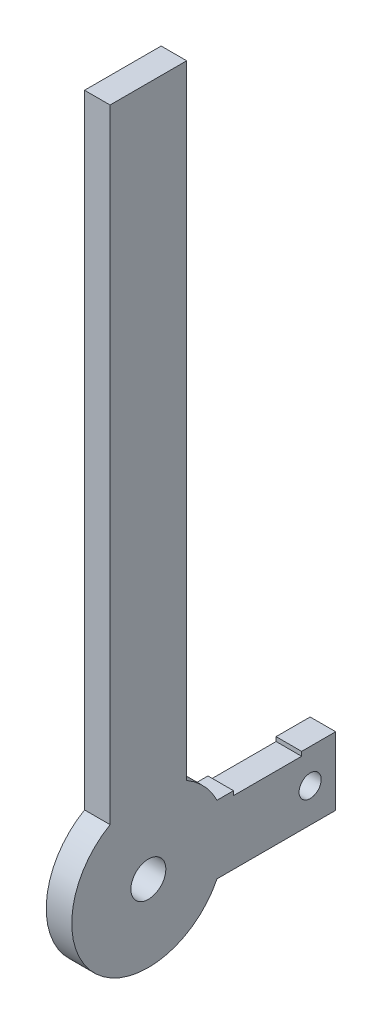
ISO-10303-21;
HEADER;
FILE_DESCRIPTION(('STEP AP214'),'2;1');
FILE_NAME('part.step','',(''),(''),'','','');
FILE_SCHEMA(('AUTOMOTIVE_DESIGN { 1 0 10303 214 1 1 1 1 }'));
ENDSEC;
DATA;
#1=APPLICATION_CONTEXT('core data for automotive mechanical design processes');
#2=APPLICATION_PROTOCOL_DEFINITION('international standard','automotive_design',2000,#1);
#3=PRODUCT_CONTEXT('',#1,'mechanical');
#4=PRODUCT('Part','Part','',(#3));
#5=PRODUCT_RELATED_PRODUCT_CATEGORY('part','',(#4));
#6=PRODUCT_DEFINITION_FORMATION('','',#4);
#7=PRODUCT_DEFINITION_CONTEXT('part definition',#1,'design');
#8=PRODUCT_DEFINITION('design','',#6,#7);
#9=PRODUCT_DEFINITION_SHAPE('','',#8);
#10=(LENGTH_UNIT() NAMED_UNIT(*) SI_UNIT(.MILLI.,.METRE.));
#11=(NAMED_UNIT(*) PLANE_ANGLE_UNIT() SI_UNIT($,.RADIAN.));
#12=(NAMED_UNIT(*) SI_UNIT($,.STERADIAN.) SOLID_ANGLE_UNIT());
#13=UNCERTAINTY_MEASURE_WITH_UNIT(LENGTH_MEASURE(1.E-05),#10,'distance_accuracy_value','');
#14=(GEOMETRIC_REPRESENTATION_CONTEXT(3) GLOBAL_UNCERTAINTY_ASSIGNED_CONTEXT((#13)) GLOBAL_UNIT_ASSIGNED_CONTEXT((#10,
#11,#12)) REPRESENTATION_CONTEXT('',''));
#15=CARTESIAN_POINT('',(0.,0.,0.));
#16=DIRECTION('',(0.,0.,1.));
#17=DIRECTION('',(1.,0.,0.));
#18=AXIS2_PLACEMENT_3D('',#15,#16,#17);
#19=CARTESIAN_POINT('',(0.,-67.,-38.));
#20=DIRECTION('',(0.,1.,0.));
#21=DIRECTION('',(0.,0.,1.));
#22=AXIS2_PLACEMENT_3D('',#19,#20,#21);
#23=PLANE('',#22);
#24=DIRECTION('',(1.,0.,0.));
#25=VECTOR('',#24,1.);
#26=CARTESIAN_POINT('',(0.,-67.,-14.));
#27=LINE('',#26,#25);
#28=CARTESIAN_POINT('',(-3.,-67.,-14.));
#29=VERTEX_POINT('',#28);
#30=CARTESIAN_POINT('',(3.,-67.,-14.));
#31=VERTEX_POINT('',#30);
#32=EDGE_CURVE('E25',#29,#31,#27,.T.);
#33=ORIENTED_EDGE('',*,*,#32,.F.);
#34=DIRECTION('',(0.,0.,1.));
#35=VECTOR('',#34,1.);
#36=CARTESIAN_POINT('',(-3.,-67.,-38.));
#37=LINE('',#36,#35);
#38=CARTESIAN_POINT('',(-3.,-67.,-10.1245154965971));
#39=VERTEX_POINT('',#38);
#40=EDGE_CURVE('E41',#29,#39,#37,.T.);
#41=ORIENTED_EDGE('',*,*,#40,.T.);
#42=DIRECTION('',(1.,0.,0.));
#43=VECTOR('',#42,1.);
#44=CARTESIAN_POINT('',(-3.,-67.,-10.1245154965971));
#45=LINE('',#44,#43);
#46=CARTESIAN_POINT('',(3.,-67.,-10.1245154965971));
#47=VERTEX_POINT('',#46);
#48=EDGE_CURVE('E191',#39,#47,#45,.T.);
#49=ORIENTED_EDGE('',*,*,#48,.T.);
#50=DIRECTION('',(0.,0.,1.));
#51=VECTOR('',#50,1.);
#52=CARTESIAN_POINT('',(3.,-67.,-38.));
#53=LINE('',#52,#51);
#54=EDGE_CURVE('E148',#31,#47,#53,.T.);
#55=ORIENTED_EDGE('',*,*,#54,.F.);
#56=EDGE_LOOP('',(#33,#41,#49,#55));
#57=FACE_BOUND('',#56,.T.);
#58=ADVANCED_FACE('F16',(#57),#23,.T.);
#59=CARTESIAN_POINT('',(-3.,-75.,6.));
#60=DIRECTION('',(1.,0.,0.));
#61=DIRECTION('',(0.,0.,-1.));
#62=AXIS2_PLACEMENT_3D('',#59,#60,#61);
#63=CYLINDRICAL_SURFACE('',#62,18.);
#64=DIRECTION('',(1.,0.,0.));
#65=VECTOR('',#64,1.);
#66=CARTESIAN_POINT('',(-3.,-83.,-10.1245154965971));
#67=LINE('',#66,#65);
#68=CARTESIAN_POINT('',(3.,-83.,-10.1245154965971));
#69=VERTEX_POINT('',#68);
#70=CARTESIAN_POINT('',(-3.,-83.,-10.1245154965971));
#71=VERTEX_POINT('',#70);
#72=EDGE_CURVE('E193',#69,#71,#67,.F.);
#73=ORIENTED_EDGE('',*,*,#72,.F.);
#74=CARTESIAN_POINT('',(3.,-75.,6.));
#75=DIRECTION('',(-1.,0.,0.));
#76=DIRECTION('',(0.,0.,1.));
#77=AXIS2_PLACEMENT_3D('',#74,#75,#76);
#78=CIRCLE('',#77,18.);
#79=CARTESIAN_POINT('',(3.,-59.4115427318801,15.));
#80=VERTEX_POINT('',#79);
#81=EDGE_CURVE('E160',#69,#80,#78,.T.);
#82=ORIENTED_EDGE('',*,*,#81,.T.);
#83=DIRECTION('',(1.,0.,0.));
#84=VECTOR('',#83,1.);
#85=CARTESIAN_POINT('',(-3.,-59.4115427318801,15.));
#86=LINE('',#85,#84);
#87=CARTESIAN_POINT('',(-3.,-59.4115427318801,15.));
#88=VERTEX_POINT('',#87);
#89=EDGE_CURVE('E167',#80,#88,#86,.F.);
#90=ORIENTED_EDGE('',*,*,#89,.T.);
#91=CARTESIAN_POINT('',(-3.,-75.,6.));
#92=DIRECTION('',(1.,0.,0.));
#93=DIRECTION('',(0.,0.,-1.));
#94=AXIS2_PLACEMENT_3D('',#91,#92,#93);
#95=CIRCLE('',#94,18.);
#96=EDGE_CURVE('E158',#88,#71,#95,.T.);
#97=ORIENTED_EDGE('',*,*,#96,.T.);
#98=EDGE_LOOP('',(#73,#82,#90,#97));
#99=FACE_BOUND('',#98,.T.);
#100=ADVANCED_FACE('F230',(#99),#63,.T.);
#101=CARTESIAN_POINT('',(0.,3.5,15.));
#102=DIRECTION('',(0.,0.,1.));
#103=DIRECTION('',(1.,0.,0.));
#104=AXIS2_PLACEMENT_3D('',#101,#102,#103);
#105=PLANE('',#104);
#106=ORIENTED_EDGE('',*,*,#89,.F.);
#107=DIRECTION('',(0.,-1.,0.));
#108=VECTOR('',#107,1.);
#109=CARTESIAN_POINT('',(3.,3.5,15.));
#110=LINE('',#109,#108);
#111=CARTESIAN_POINT('',(3.,87.,15.));
#112=VERTEX_POINT('',#111);
#113=EDGE_CURVE('E184',#112,#80,#110,.T.);
#114=ORIENTED_EDGE('',*,*,#113,.F.);
#115=DIRECTION('',(1.,0.,0.));
#116=VECTOR('',#115,1.);
#117=CARTESIAN_POINT('',(0.,87.,15.));
#118=LINE('',#117,#116);
#119=CARTESIAN_POINT('',(-3.,87.,15.));
#120=VERTEX_POINT('',#119);
#121=EDGE_CURVE('E187',#120,#112,#118,.T.);
#122=ORIENTED_EDGE('',*,*,#121,.F.);
#123=DIRECTION('',(0.,1.,0.));
#124=VECTOR('',#123,1.);
#125=CARTESIAN_POINT('',(-3.,3.5,15.));
#126=LINE('',#125,#124);
#127=EDGE_CURVE('E189',#88,#120,#126,.T.);
#128=ORIENTED_EDGE('',*,*,#127,.F.);
#129=EDGE_LOOP('',(#106,#114,#122,#128));
#130=FACE_BOUND('',#129,.T.);
#131=ADVANCED_FACE('F18',(#130),#105,.T.);
#132=CARTESIAN_POINT('',(-3.,3.5,-3.));
#133=DIRECTION('',(-1.,0.,0.));
#134=DIRECTION('',(0.,0.,1.));
#135=AXIS2_PLACEMENT_3D('',#132,#133,#134);
#136=PLANE('',#135);
#137=CARTESIAN_POINT('',(-3.,-75.,-32.));
#138=DIRECTION('',(-1.,0.,0.));
#139=DIRECTION('',(0.,0.,1.));
#140=AXIS2_PLACEMENT_3D('',#137,#138,#139);
#141=CIRCLE('',#140,2.6);
#142=CARTESIAN_POINT('',(-3.,-75.,-29.4));
#143=VERTEX_POINT('',#142);
#144=EDGE_CURVE('E199',#143,#143,#141,.T.);
#145=ORIENTED_EDGE('',*,*,#144,.F.);
#146=EDGE_LOOP('',(#145));
#147=FACE_BOUND('',#146,.T.);
#148=CARTESIAN_POINT('',(-3.,-75.,6.));
#149=DIRECTION('',(-1.,0.,0.));
#150=DIRECTION('',(0.,0.,1.));
#151=AXIS2_PLACEMENT_3D('',#148,#149,#150);
#152=CIRCLE('',#151,4.1);
#153=CARTESIAN_POINT('',(-3.,-75.,10.1));
#154=VERTEX_POINT('',#153);
#155=EDGE_CURVE('E124',#154,#154,#152,.T.);
#156=ORIENTED_EDGE('',*,*,#155,.F.);
#157=EDGE_LOOP('',(#156));
#158=FACE_BOUND('',#157,.T.);
#159=DIRECTION('',(0.,1.,0.));
#160=VECTOR('',#159,1.);
#161=CARTESIAN_POINT('',(-3.,3.5,-14.));
#162=LINE('',#161,#160);
#163=CARTESIAN_POINT('',(-3.,-68.,-14.));
#164=VERTEX_POINT('',#163);
#165=EDGE_CURVE('E128',#164,#29,#162,.T.);
#166=ORIENTED_EDGE('',*,*,#165,.F.);
#167=DIRECTION('',(0.,0.,1.));
#168=VECTOR('',#167,1.);
#169=CARTESIAN_POINT('',(-3.,-68.,-3.));
#170=LINE('',#169,#168);
#171=CARTESIAN_POINT('',(-3.,-68.,-30.));
#172=VERTEX_POINT('',#171);
#173=EDGE_CURVE('E120',#172,#164,#170,.T.);
#174=ORIENTED_EDGE('',*,*,#173,.F.);
#175=DIRECTION('',(0.,-1.,0.));
#176=VECTOR('',#175,1.);
#177=CARTESIAN_POINT('',(-3.,3.5,-30.));
#178=LINE('',#177,#176);
#179=CARTESIAN_POINT('',(-3.,-67.,-30.));
#180=VERTEX_POINT('',#179);
#181=EDGE_CURVE('E107',#180,#172,#178,.T.);
#182=ORIENTED_EDGE('',*,*,#181,.F.);
#183=CARTESIAN_POINT('',(-3.,-67.,-38.));
#184=VERTEX_POINT('',#183);
#185=EDGE_CURVE('E152',#184,#180,#37,.T.);
#186=ORIENTED_EDGE('',*,*,#185,.F.);
#187=DIRECTION('',(0.,-1.,0.));
#188=VECTOR('',#187,1.);
#189=CARTESIAN_POINT('',(-3.,-75.,-38.));
#190=LINE('',#189,#188);
#191=CARTESIAN_POINT('',(-3.,-83.,-38.));
#192=VERTEX_POINT('',#191);
#193=EDGE_CURVE('E132',#184,#192,#190,.T.);
#194=ORIENTED_EDGE('',*,*,#193,.T.);
#195=DIRECTION('',(0.,0.,1.));
#196=VECTOR('',#195,1.);
#197=CARTESIAN_POINT('',(-3.,-83.,-38.));
#198=LINE('',#197,#196);
#199=EDGE_CURVE('E154',#192,#71,#198,.T.);
#200=ORIENTED_EDGE('',*,*,#199,.T.);
#201=ORIENTED_EDGE('',*,*,#96,.F.);
#202=ORIENTED_EDGE('',*,*,#127,.T.);
#203=DIRECTION('',(0.,0.,1.));
#204=VECTOR('',#203,1.);
#205=CARTESIAN_POINT('',(-3.,87.,-3.));
#206=LINE('',#205,#204);
#207=CARTESIAN_POINT('',(-3.,87.,-3.));
#208=VERTEX_POINT('',#207);
#209=EDGE_CURVE('E181',#208,#120,#206,.T.);
#210=ORIENTED_EDGE('',*,*,#209,.F.);
#211=DIRECTION('',(0.,-1.,0.));
#212=VECTOR('',#211,1.);
#213=CARTESIAN_POINT('',(-3.,3.5,-3.));
#214=LINE('',#213,#212);
#215=CARTESIAN_POINT('',(-3.,-59.4115427318801,-3.));
#216=VERTEX_POINT('',#215);
#217=EDGE_CURVE('E170',#208,#216,#214,.T.);
#218=ORIENTED_EDGE('',*,*,#217,.T.);
#219=EDGE_CURVE('E157',#39,#216,#95,.T.);
#220=ORIENTED_EDGE('',*,*,#219,.F.);
#221=ORIENTED_EDGE('',*,*,#40,.F.);
#222=EDGE_LOOP('',(#166,#174,#182,#186,#194,#200,#201,#202,#210,#218,#220,#221));
#223=FACE_BOUND('',#222,.T.);
#224=ADVANCED_FACE('F127',(#147,#158,#223),#136,.T.);
#225=CARTESIAN_POINT('',(0.,87.,-3.));
#226=DIRECTION('',(0.,1.,0.));
#227=DIRECTION('',(0.,0.,1.));
#228=AXIS2_PLACEMENT_3D('',#225,#226,#227);
#229=PLANE('',#228);
#230=ORIENTED_EDGE('',*,*,#209,.T.);
#231=ORIENTED_EDGE('',*,*,#121,.T.);
#232=DIRECTION('',(0.,0.,1.));
#233=VECTOR('',#232,1.);
#234=CARTESIAN_POINT('',(3.,87.,-3.));
#235=LINE('',#234,#233);
#236=CARTESIAN_POINT('',(3.,87.,-3.));
#237=VERTEX_POINT('',#236);
#238=EDGE_CURVE('E173',#237,#112,#235,.T.);
#239=ORIENTED_EDGE('',*,*,#238,.F.);
#240=DIRECTION('',(-1.,0.,0.));
#241=VECTOR('',#240,1.);
#242=CARTESIAN_POINT('',(0.,87.,-3.));
#243=LINE('',#242,#241);
#244=EDGE_CURVE('E174',#237,#208,#243,.T.);
#245=ORIENTED_EDGE('',*,*,#244,.T.);
#246=EDGE_LOOP('',(#230,#231,#239,#245));
#247=FACE_BOUND('',#246,.T.);
#248=ADVANCED_FACE('F239',(#247),#229,.T.);
#249=CARTESIAN_POINT('',(0.,3.5,-3.));
#250=DIRECTION('',(0.,0.,-1.));
#251=DIRECTION('',(-1.,0.,0.));
#252=AXIS2_PLACEMENT_3D('',#249,#250,#251);
#253=PLANE('',#252);
#254=DIRECTION('',(1.,0.,0.));
#255=VECTOR('',#254,1.);
#256=CARTESIAN_POINT('',(-3.,-59.4115427318801,-3.));
#257=LINE('',#256,#255);
#258=CARTESIAN_POINT('',(3.,-59.4115427318801,-3.));
#259=VERTEX_POINT('',#258);
#260=EDGE_CURVE('E164',#216,#259,#257,.T.);
#261=ORIENTED_EDGE('',*,*,#260,.F.);
#262=ORIENTED_EDGE('',*,*,#217,.F.);
#263=ORIENTED_EDGE('',*,*,#244,.F.);
#264=DIRECTION('',(0.,1.,0.));
#265=VECTOR('',#264,1.);
#266=CARTESIAN_POINT('',(3.,3.5,-3.));
#267=LINE('',#266,#265);
#268=EDGE_CURVE('E171',#259,#237,#267,.T.);
#269=ORIENTED_EDGE('',*,*,#268,.F.);
#270=EDGE_LOOP('',(#261,#262,#263,#269));
#271=FACE_BOUND('',#270,.T.);
#272=ADVANCED_FACE('F243',(#271),#253,.T.);
#273=CARTESIAN_POINT('',(3.,3.5,-3.));
#274=DIRECTION('',(1.,0.,0.));
#275=DIRECTION('',(0.,0.,-1.));
#276=AXIS2_PLACEMENT_3D('',#273,#274,#275);
#277=PLANE('',#276);
#278=CARTESIAN_POINT('',(3.,-75.,-32.));
#279=DIRECTION('',(1.,0.,0.));
#280=DIRECTION('',(0.,0.,-1.));
#281=AXIS2_PLACEMENT_3D('',#278,#279,#280);
#282=CIRCLE('',#281,2.6);
#283=CARTESIAN_POINT('',(3.,-75.,-34.6));
#284=VERTEX_POINT('',#283);
#285=EDGE_CURVE('E20',#284,#284,#282,.T.);
#286=ORIENTED_EDGE('',*,*,#285,.F.);
#287=EDGE_LOOP('',(#286));
#288=FACE_BOUND('',#287,.T.);
#289=CARTESIAN_POINT('',(3.,-75.,6.));
#290=DIRECTION('',(1.,0.,0.));
#291=DIRECTION('',(0.,0.,-1.));
#292=AXIS2_PLACEMENT_3D('',#289,#290,#291);
#293=CIRCLE('',#292,4.1);
#294=CARTESIAN_POINT('',(3.,-75.,1.9));
#295=VERTEX_POINT('',#294);
#296=EDGE_CURVE('E197',#295,#295,#293,.T.);
#297=ORIENTED_EDGE('',*,*,#296,.F.);
#298=EDGE_LOOP('',(#297));
#299=FACE_BOUND('',#298,.T.);
#300=DIRECTION('',(0.,-1.,0.));
#301=VECTOR('',#300,1.);
#302=CARTESIAN_POINT('',(3.,3.5,-14.));
#303=LINE('',#302,#301);
#304=CARTESIAN_POINT('',(3.,-68.,-14.));
#305=VERTEX_POINT('',#304);
#306=EDGE_CURVE('E115',#31,#305,#303,.T.);
#307=ORIENTED_EDGE('',*,*,#306,.F.);
#308=ORIENTED_EDGE('',*,*,#54,.T.);
#309=EDGE_CURVE('E161',#259,#47,#78,.T.);
#310=ORIENTED_EDGE('',*,*,#309,.F.);
#311=ORIENTED_EDGE('',*,*,#268,.T.);
#312=ORIENTED_EDGE('',*,*,#238,.T.);
#313=ORIENTED_EDGE('',*,*,#113,.T.);
#314=ORIENTED_EDGE('',*,*,#81,.F.);
#315=DIRECTION('',(0.,0.,1.));
#316=VECTOR('',#315,1.);
#317=CARTESIAN_POINT('',(3.,-83.,-38.));
#318=LINE('',#317,#316);
#319=CARTESIAN_POINT('',(3.,-83.,-38.));
#320=VERTEX_POINT('',#319);
#321=EDGE_CURVE('E140',#320,#69,#318,.T.);
#322=ORIENTED_EDGE('',*,*,#321,.F.);
#323=DIRECTION('',(0.,1.,0.));
#324=VECTOR('',#323,1.);
#325=CARTESIAN_POINT('',(3.,-75.,-38.));
#326=LINE('',#325,#324);
#327=CARTESIAN_POINT('',(3.,-67.,-38.));
#328=VERTEX_POINT('',#327);
#329=EDGE_CURVE('E137',#320,#328,#326,.T.);
#330=ORIENTED_EDGE('',*,*,#329,.T.);
#331=CARTESIAN_POINT('',(3.,-67.,-30.));
#332=VERTEX_POINT('',#331);
#333=EDGE_CURVE('E149',#328,#332,#53,.T.);
#334=ORIENTED_EDGE('',*,*,#333,.T.);
#335=DIRECTION('',(0.,1.,0.));
#336=VECTOR('',#335,1.);
#337=CARTESIAN_POINT('',(3.,3.5,-30.));
#338=LINE('',#337,#336);
#339=CARTESIAN_POINT('',(3.,-68.,-30.));
#340=VERTEX_POINT('',#339);
#341=EDGE_CURVE('E33',#340,#332,#338,.T.);
#342=ORIENTED_EDGE('',*,*,#341,.F.);
#343=DIRECTION('',(0.,0.,-1.));
#344=VECTOR('',#343,1.);
#345=CARTESIAN_POINT('',(3.,-68.,-3.));
#346=LINE('',#345,#344);
#347=EDGE_CURVE('E10',#305,#340,#346,.T.);
#348=ORIENTED_EDGE('',*,*,#347,.F.);
#349=EDGE_LOOP('',(#307,#308,#310,#311,#312,#313,#314,#322,#330,#334,#342,#348));
#350=FACE_BOUND('',#349,.T.);
#351=ADVANCED_FACE('F216',(#288,#299,#350),#277,.T.);
#352=ORIENTED_EDGE('',*,*,#48,.F.);
#353=ORIENTED_EDGE('',*,*,#219,.T.);
#354=ORIENTED_EDGE('',*,*,#260,.T.);
#355=ORIENTED_EDGE('',*,*,#309,.T.);
#356=EDGE_LOOP('',(#352,#353,#354,#355));
#357=FACE_BOUND('',#356,.T.);
#358=ADVANCED_FACE('F246',(#357),#63,.T.);
#359=CARTESIAN_POINT('',(0.,-83.,-38.));
#360=DIRECTION('',(0.,-1.,0.));
#361=DIRECTION('',(0.,0.,-1.));
#362=AXIS2_PLACEMENT_3D('',#359,#360,#361);
#363=PLANE('',#362);
#364=ORIENTED_EDGE('',*,*,#321,.T.);
#365=ORIENTED_EDGE('',*,*,#72,.T.);
#366=ORIENTED_EDGE('',*,*,#199,.F.);
#367=DIRECTION('',(1.,0.,0.));
#368=VECTOR('',#367,1.);
#369=CARTESIAN_POINT('',(0.,-83.,-38.));
#370=LINE('',#369,#368);
#371=EDGE_CURVE('E129',#192,#320,#370,.T.);
#372=ORIENTED_EDGE('',*,*,#371,.T.);
#373=EDGE_LOOP('',(#364,#365,#366,#372));
#374=FACE_BOUND('',#373,.T.);
#375=ADVANCED_FACE('F227',(#374),#363,.T.);
#376=DIRECTION('',(-1.,0.,0.));
#377=VECTOR('',#376,1.);
#378=CARTESIAN_POINT('',(0.,-67.,-30.));
#379=LINE('',#378,#377);
#380=EDGE_CURVE('E111',#332,#180,#379,.T.);
#381=ORIENTED_EDGE('',*,*,#380,.F.);
#382=ORIENTED_EDGE('',*,*,#333,.F.);
#383=DIRECTION('',(-1.,0.,0.));
#384=VECTOR('',#383,1.);
#385=CARTESIAN_POINT('',(0.,-67.,-38.));
#386=LINE('',#385,#384);
#387=EDGE_CURVE('E141',#328,#184,#386,.T.);
#388=ORIENTED_EDGE('',*,*,#387,.T.);
#389=ORIENTED_EDGE('',*,*,#185,.T.);
#390=EDGE_LOOP('',(#381,#382,#388,#389));
#391=FACE_BOUND('',#390,.T.);
#392=ADVANCED_FACE('F220',(#391),#23,.T.);
#393=CARTESIAN_POINT('',(0.,-75.,-38.));
#394=DIRECTION('',(0.,0.,-1.));
#395=DIRECTION('',(-1.,0.,0.));
#396=AXIS2_PLACEMENT_3D('',#393,#394,#395);
#397=PLANE('',#396);
#398=ORIENTED_EDGE('',*,*,#329,.F.);
#399=ORIENTED_EDGE('',*,*,#371,.F.);
#400=ORIENTED_EDGE('',*,*,#193,.F.);
#401=ORIENTED_EDGE('',*,*,#387,.F.);
#402=EDGE_LOOP('',(#398,#399,#400,#401));
#403=FACE_BOUND('',#402,.T.);
#404=ADVANCED_FACE('F223',(#403),#397,.T.);
#405=CARTESIAN_POINT('',(0.,-67.5,-14.));
#406=DIRECTION('',(0.,0.,1.));
#407=DIRECTION('',(1.,0.,0.));
#408=AXIS2_PLACEMENT_3D('',#405,#406,#407);
#409=PLANE('',#408);
#410=ORIENTED_EDGE('',*,*,#165,.T.);
#411=ORIENTED_EDGE('',*,*,#32,.T.);
#412=ORIENTED_EDGE('',*,*,#306,.T.);
#413=DIRECTION('',(-1.,0.,0.));
#414=VECTOR('',#413,1.);
#415=CARTESIAN_POINT('',(0.,-68.,-14.));
#416=LINE('',#415,#414);
#417=EDGE_CURVE('E123',#305,#164,#416,.T.);
#418=ORIENTED_EDGE('',*,*,#417,.T.);
#419=EDGE_LOOP('',(#410,#411,#412,#418));
#420=FACE_BOUND('',#419,.T.);
#421=ADVANCED_FACE('F213',(#420),#409,.F.);
#422=CARTESIAN_POINT('',(0.,-68.,-30.));
#423=DIRECTION('',(0.,-1.,0.));
#424=DIRECTION('',(0.,0.,-1.));
#425=AXIS2_PLACEMENT_3D('',#422,#423,#424);
#426=PLANE('',#425);
#427=ORIENTED_EDGE('',*,*,#173,.T.);
#428=ORIENTED_EDGE('',*,*,#417,.F.);
#429=ORIENTED_EDGE('',*,*,#347,.T.);
#430=DIRECTION('',(1.,0.,0.));
#431=VECTOR('',#430,1.);
#432=CARTESIAN_POINT('',(0.,-68.,-30.));
#433=LINE('',#432,#431);
#434=EDGE_CURVE('E110',#172,#340,#433,.T.);
#435=ORIENTED_EDGE('',*,*,#434,.F.);
#436=EDGE_LOOP('',(#427,#428,#429,#435));
#437=FACE_BOUND('',#436,.T.);
#438=ADVANCED_FACE('F118',(#437),#426,.F.);
#439=CARTESIAN_POINT('',(0.,-67.5,-30.));
#440=DIRECTION('',(0.,0.,-1.));
#441=DIRECTION('',(-1.,0.,0.));
#442=AXIS2_PLACEMENT_3D('',#439,#440,#441);
#443=PLANE('',#442);
#444=ORIENTED_EDGE('',*,*,#181,.T.);
#445=ORIENTED_EDGE('',*,*,#434,.T.);
#446=ORIENTED_EDGE('',*,*,#341,.T.);
#447=ORIENTED_EDGE('',*,*,#380,.T.);
#448=EDGE_LOOP('',(#444,#445,#446,#447));
#449=FACE_BOUND('',#448,.T.);
#450=ADVANCED_FACE('F109',(#449),#443,.F.);
#451=CARTESIAN_POINT('',(-3.3,-75.,6.));
#452=DIRECTION('',(1.,0.,0.));
#453=DIRECTION('',(0.,0.,-1.));
#454=AXIS2_PLACEMENT_3D('',#451,#452,#453);
#455=CYLINDRICAL_SURFACE('',#454,4.1);
#456=ORIENTED_EDGE('',*,*,#155,.T.);
#457=EDGE_LOOP('',(#456));
#458=FACE_BOUND('',#457,.T.);
#459=ORIENTED_EDGE('',*,*,#296,.T.);
#460=EDGE_LOOP('',(#459));
#461=FACE_BOUND('',#460,.T.);
#462=ADVANCED_FACE('F279',(#458,#461),#455,.F.);
#463=CARTESIAN_POINT('',(-3.3,-75.,-32.));
#464=DIRECTION('',(1.,0.,0.));
#465=DIRECTION('',(0.,0.,-1.));
#466=AXIS2_PLACEMENT_3D('',#463,#464,#465);
#467=CYLINDRICAL_SURFACE('',#466,2.6);
#468=ORIENTED_EDGE('',*,*,#144,.T.);
#469=EDGE_LOOP('',(#468));
#470=FACE_BOUND('',#469,.T.);
#471=ORIENTED_EDGE('',*,*,#285,.T.);
#472=EDGE_LOOP('',(#471));
#473=FACE_BOUND('',#472,.T.);
#474=ADVANCED_FACE('F281',(#470,#473),#467,.F.);
#475=CLOSED_SHELL('',(#58,#100,#131,#224,#248,#272,#351,#358,#375,#392,#404,#421,#438,#450,#462,#474));
#476=MANIFOLD_SOLID_BREP('B1',#475);
#477=ADVANCED_BREP_SHAPE_REPRESENTATION('',(#18,#476),#14);
#478=SHAPE_DEFINITION_REPRESENTATION(#9,#477);
ENDSEC;
END-ISO-10303-21;
